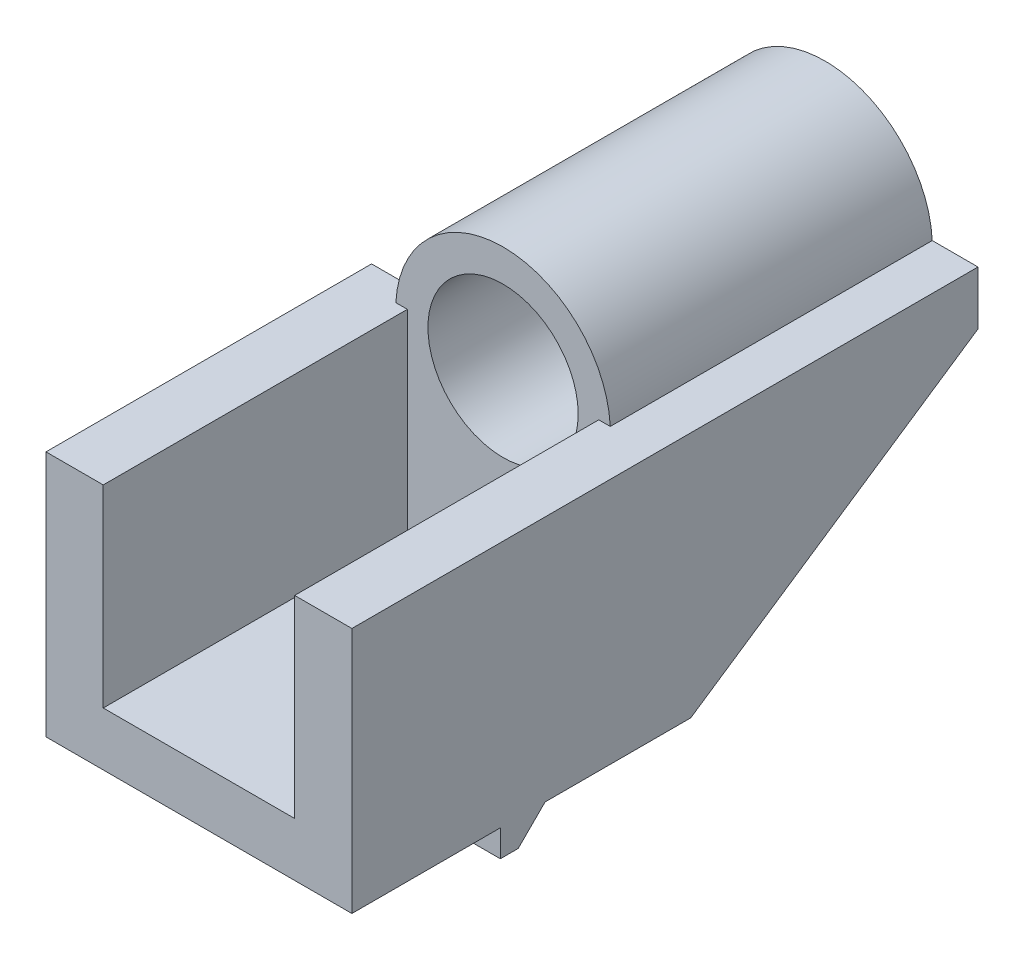
ISO-10303-21;
HEADER;
FILE_DESCRIPTION(('STEP AP214'),'2;1');
FILE_NAME('part.step','',(''),(''),'','','');
FILE_SCHEMA(('AUTOMOTIVE_DESIGN { 1 0 10303 214 1 1 1 1 }'));
ENDSEC;
DATA;
#1=APPLICATION_CONTEXT('core data for automotive mechanical design processes');
#2=APPLICATION_PROTOCOL_DEFINITION('international standard','automotive_design',2000,#1);
#3=PRODUCT_CONTEXT('',#1,'mechanical');
#4=PRODUCT('Part','Part','',(#3));
#5=PRODUCT_RELATED_PRODUCT_CATEGORY('part','',(#4));
#6=PRODUCT_DEFINITION_FORMATION('','',#4);
#7=PRODUCT_DEFINITION_CONTEXT('part definition',#1,'design');
#8=PRODUCT_DEFINITION('design','',#6,#7);
#9=PRODUCT_DEFINITION_SHAPE('','',#8);
#10=(LENGTH_UNIT() NAMED_UNIT(*) SI_UNIT(.MILLI.,.METRE.));
#11=(NAMED_UNIT(*) PLANE_ANGLE_UNIT() SI_UNIT($,.RADIAN.));
#12=(NAMED_UNIT(*) SI_UNIT($,.STERADIAN.) SOLID_ANGLE_UNIT());
#13=UNCERTAINTY_MEASURE_WITH_UNIT(LENGTH_MEASURE(1.E-05),#10,'distance_accuracy_value','');
#14=(GEOMETRIC_REPRESENTATION_CONTEXT(3) GLOBAL_UNCERTAINTY_ASSIGNED_CONTEXT((#13)) GLOBAL_UNIT_ASSIGNED_CONTEXT((#10,
#11,#12)) REPRESENTATION_CONTEXT('',''));
#15=CARTESIAN_POINT('',(0.,0.,0.));
#16=DIRECTION('',(0.,0.,1.));
#17=DIRECTION('',(1.,0.,0.));
#18=AXIS2_PLACEMENT_3D('',#15,#16,#17);
#19=CARTESIAN_POINT('',(8.55,0.,35.));
#20=DIRECTION('',(0.,-1.,0.));
#21=DIRECTION('',(0.,0.,-1.));
#22=AXIS2_PLACEMENT_3D('',#19,#20,#21);
#23=PLANE('',#22);
#24=DIRECTION('',(1.,0.,0.));
#25=VECTOR('',#24,1.);
#26=CARTESIAN_POINT('',(-5.99240744087883,0.,16.8));
#27=LINE('',#26,#25);
#28=CARTESIAN_POINT('',(-8.55,0.,16.8));
#29=VERTEX_POINT('',#28);
#30=CARTESIAN_POINT('',(-5.99240744087883,0.,16.8));
#31=VERTEX_POINT('',#30);
#32=EDGE_CURVE('E645',#29,#31,#27,.T.);
#33=ORIENTED_EDGE('',*,*,#32,.F.);
#34=DIRECTION('',(0.,0.,1.));
#35=VECTOR('',#34,1.);
#36=CARTESIAN_POINT('',(-8.55,0.,35.));
#37=LINE('',#36,#35);
#38=CARTESIAN_POINT('',(-8.55,0.,35.));
#39=VERTEX_POINT('',#38);
#40=EDGE_CURVE('E433',#29,#39,#37,.T.);
#41=ORIENTED_EDGE('',*,*,#40,.T.);
#42=DIRECTION('',(-1.,0.,0.));
#43=VECTOR('',#42,1.);
#44=CARTESIAN_POINT('',(8.55,0.,35.));
#45=LINE('',#44,#43);
#46=CARTESIAN_POINT('',(-5.35,0.,35.));
#47=VERTEX_POINT('',#46);
#48=EDGE_CURVE('E447',#47,#39,#45,.T.);
#49=ORIENTED_EDGE('',*,*,#48,.F.);
#50=DIRECTION('',(0.,0.,1.));
#51=VECTOR('',#50,1.);
#52=CARTESIAN_POINT('',(-5.35,0.,18.));
#53=LINE('',#52,#51);
#54=CARTESIAN_POINT('',(-5.35,0.,18.));
#55=VERTEX_POINT('',#54);
#56=EDGE_CURVE('E436',#55,#47,#53,.T.);
#57=ORIENTED_EDGE('',*,*,#56,.F.);
#58=DIRECTION('',(-1.,0.,0.));
#59=VECTOR('',#58,1.);
#60=CARTESIAN_POINT('',(8.55,0.,18.));
#61=LINE('',#60,#59);
#62=CARTESIAN_POINT('',(-5.99240744087883,0.,18.));
#63=VERTEX_POINT('',#62);
#64=EDGE_CURVE('E473',#55,#63,#61,.T.);
#65=ORIENTED_EDGE('',*,*,#64,.T.);
#66=DIRECTION('',(0.,0.,1.));
#67=VECTOR('',#66,1.);
#68=CARTESIAN_POINT('',(-5.99240744087883,0.,0.));
#69=LINE('',#68,#67);
#70=EDGE_CURVE('E464',#63,#31,#69,.F.);
#71=ORIENTED_EDGE('',*,*,#70,.T.);
#72=EDGE_LOOP('',(#33,#41,#49,#57,#65,#71));
#73=FACE_BOUND('',#72,.T.);
#74=ADVANCED_FACE('F33',(#73),#23,.F.);
#75=CARTESIAN_POINT('',(8.55,-13.8,16.0587));
#76=DIRECTION('',(0.,1.,0.));
#77=DIRECTION('',(0.,0.,1.));
#78=AXIS2_PLACEMENT_3D('',#75,#76,#77);
#79=PLANE('',#78);
#80=CARTESIAN_POINT('',(0.,-13.8,25.));
#81=DIRECTION('',(0.,1.,0.));
#82=DIRECTION('',(0.,0.,1.));
#83=AXIS2_PLACEMENT_3D('',#80,#81,#82);
#84=CIRCLE('',#83,2.2);
#85=CARTESIAN_POINT('',(0.,-13.8,27.2));
#86=VERTEX_POINT('',#85);
#87=EDGE_CURVE('E316',#86,#86,#84,.T.);
#88=ORIENTED_EDGE('',*,*,#87,.T.);
#89=EDGE_LOOP('',(#88));
#90=FACE_BOUND('',#89,.T.);
#91=DIRECTION('',(0.,0.,1.));
#92=VECTOR('',#91,1.);
#93=CARTESIAN_POINT('',(5.353,-13.8,0.));
#94=LINE('',#93,#92);
#95=CARTESIAN_POINT('',(5.353,-13.8,16.0587));
#96=VERTEX_POINT('',#95);
#97=CARTESIAN_POINT('',(5.353,-13.8,16.8));
#98=VERTEX_POINT('',#97);
#99=EDGE_CURVE('E262',#96,#98,#94,.T.);
#100=ORIENTED_EDGE('',*,*,#99,.F.);
#101=DIRECTION('',(1.,0.,0.));
#102=VECTOR('',#101,1.);
#103=CARTESIAN_POINT('',(-8.55105,-13.8,16.0587));
#104=LINE('',#103,#102);
#105=CARTESIAN_POINT('',(8.55,-13.8,16.0587));
#106=VERTEX_POINT('',#105);
#107=EDGE_CURVE('E47',#96,#106,#104,.T.);
#108=ORIENTED_EDGE('',*,*,#107,.T.);
#109=DIRECTION('',(0.,0.,-1.));
#110=VECTOR('',#109,1.);
#111=CARTESIAN_POINT('',(8.55,-13.8,16.0587));
#112=LINE('',#111,#110);
#113=CARTESIAN_POINT('',(8.55,-13.8,24.202));
#114=VERTEX_POINT('',#113);
#115=EDGE_CURVE('E416',#114,#106,#112,.T.);
#116=ORIENTED_EDGE('',*,*,#115,.F.);
#117=DIRECTION('',(1.,0.,0.));
#118=VECTOR('',#117,1.);
#119=CARTESIAN_POINT('',(-8.55,-13.8,24.202));
#120=LINE('',#119,#118);
#121=CARTESIAN_POINT('',(4.053,-13.8,24.202));
#122=VERTEX_POINT('',#121);
#123=EDGE_CURVE('E351',#122,#114,#120,.T.);
#124=ORIENTED_EDGE('',*,*,#123,.F.);
#125=DIRECTION('',(0.,0.,1.));
#126=VECTOR('',#125,1.);
#127=CARTESIAN_POINT('',(4.053,-13.8,-0.001000000000001));
#128=LINE('',#127,#126);
#129=CARTESIAN_POINT('',(4.053,-13.8,26.702));
#130=VERTEX_POINT('',#129);
#131=EDGE_CURVE('E310',#122,#130,#128,.T.);
#132=ORIENTED_EDGE('',*,*,#131,.T.);
#133=DIRECTION('',(1.,0.,0.));
#134=VECTOR('',#133,1.);
#135=CARTESIAN_POINT('',(-8.55,-13.8,26.702));
#136=LINE('',#135,#134);
#137=CARTESIAN_POINT('',(8.55,-13.8,26.702));
#138=VERTEX_POINT('',#137);
#139=EDGE_CURVE('E354',#130,#138,#136,.T.);
#140=ORIENTED_EDGE('',*,*,#139,.T.);
#141=CARTESIAN_POINT('',(8.55,-13.8,35.));
#142=VERTEX_POINT('',#141);
#143=EDGE_CURVE('E404',#142,#138,#112,.T.);
#144=ORIENTED_EDGE('',*,*,#143,.F.);
#145=DIRECTION('',(-1.,0.,0.));
#146=VECTOR('',#145,1.);
#147=CARTESIAN_POINT('',(8.55,-13.8,35.));
#148=LINE('',#147,#146);
#149=CARTESIAN_POINT('',(-8.55,-13.8,35.));
#150=VERTEX_POINT('',#149);
#151=EDGE_CURVE('E448',#142,#150,#148,.T.);
#152=ORIENTED_EDGE('',*,*,#151,.T.);
#153=DIRECTION('',(0.,0.,-1.));
#154=VECTOR('',#153,1.);
#155=CARTESIAN_POINT('',(-8.55,-13.8,16.0587));
#156=LINE('',#155,#154);
#157=CARTESIAN_POINT('',(-8.55,-13.8,26.702));
#158=VERTEX_POINT('',#157);
#159=EDGE_CURVE('E441',#150,#158,#156,.T.);
#160=ORIENTED_EDGE('',*,*,#159,.T.);
#161=CARTESIAN_POINT('',(-4.053,-13.8,26.702));
#162=VERTEX_POINT('',#161);
#163=EDGE_CURVE('E369',#158,#162,#136,.T.);
#164=ORIENTED_EDGE('',*,*,#163,.T.);
#165=DIRECTION('',(0.,0.,1.));
#166=VECTOR('',#165,1.);
#167=CARTESIAN_POINT('',(-4.053,-13.8,-0.001000000000001));
#168=LINE('',#167,#166);
#169=CARTESIAN_POINT('',(-4.053,-13.8,24.202));
#170=VERTEX_POINT('',#169);
#171=EDGE_CURVE('E299',#170,#162,#168,.T.);
#172=ORIENTED_EDGE('',*,*,#171,.F.);
#173=CARTESIAN_POINT('',(-8.55,-13.8,24.202));
#174=VERTEX_POINT('',#173);
#175=EDGE_CURVE('E347',#174,#170,#120,.T.);
#176=ORIENTED_EDGE('',*,*,#175,.F.);
#177=CARTESIAN_POINT('',(-8.55,-13.8,16.8));
#178=VERTEX_POINT('',#177);
#179=EDGE_CURVE('E423',#174,#178,#156,.T.);
#180=ORIENTED_EDGE('',*,*,#179,.T.);
#181=DIRECTION('',(-1.,0.,0.));
#182=VECTOR('',#181,1.);
#183=CARTESIAN_POINT('',(-8.55,-13.8,16.8));
#184=LINE('',#183,#182);
#185=CARTESIAN_POINT('',(-5.353,-13.8,16.8));
#186=VERTEX_POINT('',#185);
#187=EDGE_CURVE('E234',#186,#178,#184,.T.);
#188=ORIENTED_EDGE('',*,*,#187,.F.);
#189=DIRECTION('',(-0.707106781186547,0.,0.707106781186548));
#190=VECTOR('',#189,1.);
#191=CARTESIAN_POINT('',(-1.553,-13.8,13.));
#192=LINE('',#191,#190);
#193=CARTESIAN_POINT('',(-1.553,-13.8,13.));
#194=VERTEX_POINT('',#193);
#195=EDGE_CURVE('E245',#194,#186,#192,.T.);
#196=ORIENTED_EDGE('',*,*,#195,.F.);
#197=DIRECTION('',(0.,0.,1.));
#198=VECTOR('',#197,1.);
#199=CARTESIAN_POINT('',(-1.553,-13.8,0.));
#200=LINE('',#199,#198);
#201=CARTESIAN_POINT('',(-1.553,-13.8,15.002));
#202=VERTEX_POINT('',#201);
#203=EDGE_CURVE('E288',#194,#202,#200,.T.);
#204=ORIENTED_EDGE('',*,*,#203,.T.);
#205=DIRECTION('',(1.,0.,0.));
#206=VECTOR('',#205,1.);
#207=CARTESIAN_POINT('',(-8.55,-13.8,15.002));
#208=LINE('',#207,#206);
#209=CARTESIAN_POINT('',(1.553,-13.8,15.002));
#210=VERTEX_POINT('',#209);
#211=EDGE_CURVE('E319',#202,#210,#208,.T.);
#212=ORIENTED_EDGE('',*,*,#211,.T.);
#213=DIRECTION('',(0.,0.,1.));
#214=VECTOR('',#213,1.);
#215=CARTESIAN_POINT('',(1.553,-13.8,0.));
#216=LINE('',#215,#214);
#217=CARTESIAN_POINT('',(1.553,-13.8,13.));
#218=VERTEX_POINT('',#217);
#219=EDGE_CURVE('E276',#218,#210,#216,.T.);
#220=ORIENTED_EDGE('',*,*,#219,.F.);
#221=DIRECTION('',(-0.707106781186548,0.,-0.707106781186547));
#222=VECTOR('',#221,1.);
#223=CARTESIAN_POINT('',(5.353,-13.8,16.8));
#224=LINE('',#223,#222);
#225=EDGE_CURVE('E264',#98,#218,#224,.T.);
#226=ORIENTED_EDGE('',*,*,#225,.F.);
#227=EDGE_LOOP('',(#100,#108,#116,#124,#132,#140,#144,#152,#160,#164,#172,#176,#180,#188,#196,
#204,#212,#220,#226));
#228=FACE_BOUND('',#227,.T.);
#229=ADVANCED_FACE('F401',(#90,#228),#79,.F.);
#230=CARTESIAN_POINT('',(-8.55,0.,0.));
#231=DIRECTION('',(-1.,0.,0.));
#232=DIRECTION('',(0.,0.,1.));
#233=AXIS2_PLACEMENT_3D('',#230,#231,#232);
#234=PLANE('',#233);
#235=ORIENTED_EDGE('',*,*,#40,.F.);
#236=DIRECTION('',(0.,1.,0.));
#237=VECTOR('',#236,1.);
#238=CARTESIAN_POINT('',(-8.55,0.,16.8));
#239=LINE('',#238,#237);
#240=EDGE_CURVE('E643',#178,#29,#239,.T.);
#241=ORIENTED_EDGE('',*,*,#240,.F.);
#242=ORIENTED_EDGE('',*,*,#179,.F.);
#243=DIRECTION('',(0.,0.707106781186548,-0.707106781186547));
#244=VECTOR('',#243,1.);
#245=CARTESIAN_POINT('',(-8.55,-15.3,25.702));
#246=LINE('',#245,#244);
#247=CARTESIAN_POINT('',(-8.55,-15.3,25.702));
#248=VERTEX_POINT('',#247);
#249=EDGE_CURVE('E335',#248,#174,#246,.T.);
#250=ORIENTED_EDGE('',*,*,#249,.F.);
#251=DIRECTION('',(0.,0.,-1.));
#252=VECTOR('',#251,1.);
#253=CARTESIAN_POINT('',(-8.55,-15.3,26.702));
#254=LINE('',#253,#252);
#255=CARTESIAN_POINT('',(-8.55,-15.3,26.702));
#256=VERTEX_POINT('',#255);
#257=EDGE_CURVE('E332',#256,#248,#254,.T.);
#258=ORIENTED_EDGE('',*,*,#257,.F.);
#259=DIRECTION('',(0.,-1.,0.));
#260=VECTOR('',#259,1.);
#261=CARTESIAN_POINT('',(-8.55,-13.8,26.702));
#262=LINE('',#261,#260);
#263=EDGE_CURVE('E336',#158,#256,#262,.T.);
#264=ORIENTED_EDGE('',*,*,#263,.F.);
#265=ORIENTED_EDGE('',*,*,#159,.F.);
#266=DIRECTION('',(0.,-1.,0.));
#267=VECTOR('',#266,1.);
#268=CARTESIAN_POINT('',(-8.55,-13.8,35.));
#269=LINE('',#268,#267);
#270=EDGE_CURVE('E435',#39,#150,#269,.T.);
#271=ORIENTED_EDGE('',*,*,#270,.F.);
#272=EDGE_LOOP('',(#235,#241,#242,#250,#258,#264,#265,#271));
#273=FACE_BOUND('',#272,.T.);
#274=ADVANCED_FACE('F508',(#273),#234,.T.);
#275=CARTESIAN_POINT('',(0.,-0.301750000000001,16.8));
#276=DIRECTION('',(0.,0.,-1.));
#277=DIRECTION('',(0.,1.,0.));
#278=AXIS2_PLACEMENT_3D('',#275,#276,#277);
#279=PLANE('',#278);
#280=DIRECTION('',(0.659479829449439,-0.751722258915711,0.));
#281=VECTOR('',#280,1.);
#282=CARTESIAN_POINT('',(1.553,-6.09728198593538,16.8));
#283=LINE('',#282,#281);
#284=CARTESIAN_POINT('',(1.553,-6.09728198593538,16.8));
#285=VERTEX_POINT('',#284);
#286=CARTESIAN_POINT('',(5.353,-10.4287936657762,16.8));
#287=VERTEX_POINT('',#286);
#288=EDGE_CURVE('E655',#285,#287,#283,.T.);
#289=ORIENTED_EDGE('',*,*,#288,.F.);
#290=CARTESIAN_POINT('',(0.,-0.301750000000001,16.8));
#291=DIRECTION('',(0.,0.,1.));
#292=DIRECTION('',(0.,1.,0.));
#293=AXIS2_PLACEMENT_3D('',#290,#291,#292);
#294=CIRCLE('',#293,6.);
#295=CARTESIAN_POINT('',(5.35905280226833,-3.,16.8));
#296=VERTEX_POINT('',#295);
#297=EDGE_CURVE('E668',#285,#296,#294,.T.);
#298=ORIENTED_EDGE('',*,*,#297,.T.);
#299=DIRECTION('',(-0.000814775659621067,-0.999999668070257,0.));
#300=VECTOR('',#299,1.);
#301=CARTESIAN_POINT('',(5.35905280226833,-3.,16.8));
#302=LINE('',#301,#300);
#303=EDGE_CURVE('E255',#296,#287,#302,.T.);
#304=ORIENTED_EDGE('',*,*,#303,.T.);
#305=EDGE_LOOP('',(#289,#298,#304));
#306=FACE_BOUND('',#305,.T.);
#307=ADVANCED_FACE('F611',(#306),#279,.T.);
#308=CARTESIAN_POINT('',(8.55,-3.,0.));
#309=DIRECTION('',(0.,0.829796898853625,0.558065503908732));
#310=DIRECTION('',(0.,-0.558065503908732,0.829796898853625));
#311=AXIS2_PLACEMENT_3D('',#308,#309,#310);
#312=PLANE('',#311);
#313=DIRECTION('',(0.,0.558065503908732,-0.829796898853625));
#314=VECTOR('',#313,1.);
#315=CARTESIAN_POINT('',(8.55,-3.,0.));
#316=LINE('',#315,#314);
#317=CARTESIAN_POINT('',(8.55,-3.,0.));
#318=VERTEX_POINT('',#317);
#319=EDGE_CURVE('E415',#106,#318,#316,.T.);
#320=ORIENTED_EDGE('',*,*,#319,.F.);
#321=ORIENTED_EDGE('',*,*,#107,.F.);
#322=DIRECTION('',(0.,0.558065503908732,-0.829796898853625));
#323=VECTOR('',#322,1.);
#324=CARTESIAN_POINT('',(5.353,-13.8,16.0587));
#325=LINE('',#324,#323);
#326=CARTESIAN_POINT('',(5.353,-10.4287936657762,11.0459971148705));
#327=VERTEX_POINT('',#326);
#328=EDGE_CURVE('E225',#96,#327,#325,.T.);
#329=ORIENTED_EDGE('',*,*,#328,.T.);
#330=DIRECTION('',(0.000454698292982337,0.558065446218557,-0.829796813073143));
#331=VECTOR('',#330,1.);
#332=CARTESIAN_POINT('',(5.35905346199838,-2.99919029266284,-0.00120396733473974));
#333=LINE('',#332,#331);
#334=CARTESIAN_POINT('',(5.35905280226833,-3.,0.));
#335=VERTEX_POINT('',#334);
#336=EDGE_CURVE('E229',#327,#335,#333,.T.);
#337=ORIENTED_EDGE('',*,*,#336,.T.);
#338=DIRECTION('',(-1.,0.,0.));
#339=VECTOR('',#338,1.);
#340=CARTESIAN_POINT('',(8.55,-3.,0.));
#341=LINE('',#340,#339);
#342=EDGE_CURVE('E449',#318,#335,#341,.T.);
#343=ORIENTED_EDGE('',*,*,#342,.F.);
#344=EDGE_LOOP('',(#320,#321,#329,#337,#343));
#345=FACE_BOUND('',#344,.T.);
#346=ADVANCED_FACE('F227',(#345),#312,.F.);
#347=CARTESIAN_POINT('',(-8.55,-15.3,25.702));
#348=DIRECTION('',(0.,-0.707106781186547,-0.707106781186548));
#349=DIRECTION('',(0.,0.707106781186548,-0.707106781186547));
#350=AXIS2_PLACEMENT_3D('',#347,#348,#349);
#351=PLANE('',#350);
#352=DIRECTION('',(0.,0.707106781186548,-0.707106781186547));
#353=VECTOR('',#352,1.);
#354=CARTESIAN_POINT('',(4.053,-1.6985,12.1005));
#355=LINE('',#354,#353);
#356=CARTESIAN_POINT('',(4.053,-15.3,25.702));
#357=VERTEX_POINT('',#356);
#358=EDGE_CURVE('E297',#357,#122,#355,.T.);
#359=ORIENTED_EDGE('',*,*,#358,.T.);
#360=ORIENTED_EDGE('',*,*,#123,.T.);
#361=DIRECTION('',(0.,0.707106781186548,-0.707106781186547));
#362=VECTOR('',#361,1.);
#363=CARTESIAN_POINT('',(8.55,-15.3,25.702));
#364=LINE('',#363,#362);
#365=CARTESIAN_POINT('',(8.55,-15.3,25.702));
#366=VERTEX_POINT('',#365);
#367=EDGE_CURVE('E340',#366,#114,#364,.T.);
#368=ORIENTED_EDGE('',*,*,#367,.F.);
#369=DIRECTION('',(1.,0.,0.));
#370=VECTOR('',#369,1.);
#371=CARTESIAN_POINT('',(-8.55,-15.3,25.702));
#372=LINE('',#371,#370);
#373=EDGE_CURVE('E357',#357,#366,#372,.T.);
#374=ORIENTED_EDGE('',*,*,#373,.F.);
#375=EDGE_LOOP('',(#359,#360,#368,#374));
#376=FACE_BOUND('',#375,.T.);
#377=ADVANCED_FACE('F534',(#376),#351,.T.);
#378=CARTESIAN_POINT('',(-8.55,-15.3,26.702));
#379=DIRECTION('',(0.,-1.,0.));
#380=DIRECTION('',(0.,0.,-1.));
#381=AXIS2_PLACEMENT_3D('',#378,#379,#380);
#382=PLANE('',#381);
#383=DIRECTION('',(0.,0.,1.));
#384=VECTOR('',#383,1.);
#385=CARTESIAN_POINT('',(4.053,-15.3,-0.001000000000001));
#386=LINE('',#385,#384);
#387=CARTESIAN_POINT('',(4.053,-15.3,26.702));
#388=VERTEX_POINT('',#387);
#389=EDGE_CURVE('E309',#357,#388,#386,.T.);
#390=ORIENTED_EDGE('',*,*,#389,.F.);
#391=ORIENTED_EDGE('',*,*,#373,.T.);
#392=DIRECTION('',(0.,0.,-1.));
#393=VECTOR('',#392,1.);
#394=CARTESIAN_POINT('',(8.55,-15.3,26.702));
#395=LINE('',#394,#393);
#396=CARTESIAN_POINT('',(8.55,-15.3,26.702));
#397=VERTEX_POINT('',#396);
#398=EDGE_CURVE('E337',#397,#366,#395,.T.);
#399=ORIENTED_EDGE('',*,*,#398,.F.);
#400=DIRECTION('',(1.,0.,0.));
#401=VECTOR('',#400,1.);
#402=CARTESIAN_POINT('',(-8.55,-15.3,26.702));
#403=LINE('',#402,#401);
#404=EDGE_CURVE('E365',#388,#397,#403,.T.);
#405=ORIENTED_EDGE('',*,*,#404,.F.);
#406=EDGE_LOOP('',(#390,#391,#399,#405));
#407=FACE_BOUND('',#406,.T.);
#408=ADVANCED_FACE('F551',(#407),#382,.T.);
#409=CARTESIAN_POINT('',(-8.55,-13.8,26.702));
#410=DIRECTION('',(0.,0.,1.));
#411=DIRECTION('',(1.,0.,0.));
#412=AXIS2_PLACEMENT_3D('',#409,#410,#411);
#413=PLANE('',#412);
#414=DIRECTION('',(0.,1.,0.));
#415=VECTOR('',#414,1.);
#416=CARTESIAN_POINT('',(4.053,-13.8,26.702));
#417=LINE('',#416,#415);
#418=EDGE_CURVE('E306',#388,#130,#417,.T.);
#419=ORIENTED_EDGE('',*,*,#418,.F.);
#420=ORIENTED_EDGE('',*,*,#404,.T.);
#421=DIRECTION('',(0.,-1.,0.));
#422=VECTOR('',#421,1.);
#423=CARTESIAN_POINT('',(8.55,-13.8,26.702));
#424=LINE('',#423,#422);
#425=EDGE_CURVE('E323',#138,#397,#424,.T.);
#426=ORIENTED_EDGE('',*,*,#425,.F.);
#427=ORIENTED_EDGE('',*,*,#139,.F.);
#428=EDGE_LOOP('',(#419,#420,#426,#427));
#429=FACE_BOUND('',#428,.T.);
#430=ADVANCED_FACE('F409',(#429),#413,.T.);
#431=DIRECTION('',(-1.,0.,0.));
#432=VECTOR('',#431,1.);
#433=CARTESIAN_POINT('',(8.55,0.,0.));
#434=LINE('',#433,#432);
#435=CARTESIAN_POINT('',(8.55,0.,0.));
#436=VERTEX_POINT('',#435);
#437=CARTESIAN_POINT('',(5.99240744087883,0.,0.));
#438=VERTEX_POINT('',#437);
#439=EDGE_CURVE('E432',#436,#438,#434,.T.);
#440=ORIENTED_EDGE('',*,*,#439,.T.);
#441=DIRECTION('',(0.,0.,1.));
#442=VECTOR('',#441,1.);
#443=CARTESIAN_POINT('',(5.99240744087883,0.,0.));
#444=LINE('',#443,#442);
#445=CARTESIAN_POINT('',(5.99240744087883,0.,18.));
#446=VERTEX_POINT('',#445);
#447=EDGE_CURVE('E460',#438,#446,#444,.T.);
#448=ORIENTED_EDGE('',*,*,#447,.T.);
#449=CARTESIAN_POINT('',(5.35,0.,18.));
#450=VERTEX_POINT('',#449);
#451=EDGE_CURVE('E474',#446,#450,#61,.T.);
#452=ORIENTED_EDGE('',*,*,#451,.T.);
#453=DIRECTION('',(0.,0.,1.));
#454=VECTOR('',#453,1.);
#455=CARTESIAN_POINT('',(5.35,0.,18.));
#456=LINE('',#455,#454);
#457=CARTESIAN_POINT('',(5.35,0.,35.));
#458=VERTEX_POINT('',#457);
#459=EDGE_CURVE('E492',#450,#458,#456,.T.);
#460=ORIENTED_EDGE('',*,*,#459,.T.);
#461=CARTESIAN_POINT('',(8.55,0.,35.));
#462=VERTEX_POINT('',#461);
#463=EDGE_CURVE('E40',#462,#458,#45,.T.);
#464=ORIENTED_EDGE('',*,*,#463,.F.);
#465=DIRECTION('',(0.,0.,1.));
#466=VECTOR('',#465,1.);
#467=CARTESIAN_POINT('',(8.55,0.,35.));
#468=LINE('',#467,#466);
#469=EDGE_CURVE('E444',#436,#462,#468,.T.);
#470=ORIENTED_EDGE('',*,*,#469,.F.);
#471=EDGE_LOOP('',(#440,#448,#452,#460,#464,#470));
#472=FACE_BOUND('',#471,.T.);
#473=ADVANCED_FACE('F458',(#472),#23,.F.);
#474=CARTESIAN_POINT('',(8.55,-13.8,35.));
#475=DIRECTION('',(0.,0.,-1.));
#476=DIRECTION('',(-1.,0.,0.));
#477=AXIS2_PLACEMENT_3D('',#474,#475,#476);
#478=PLANE('',#477);
#479=DIRECTION('',(1.,0.,0.));
#480=VECTOR('',#479,1.);
#481=CARTESIAN_POINT('',(-5.35,-10.8,35.));
#482=LINE('',#481,#480);
#483=CARTESIAN_POINT('',(-5.35,-10.8,35.));
#484=VERTEX_POINT('',#483);
#485=CARTESIAN_POINT('',(5.35,-10.8,35.));
#486=VERTEX_POINT('',#485);
#487=EDGE_CURVE('E487',#484,#486,#482,.T.);
#488=ORIENTED_EDGE('',*,*,#487,.F.);
#489=DIRECTION('',(0.,-1.,0.));
#490=VECTOR('',#489,1.);
#491=CARTESIAN_POINT('',(-5.35,0.,35.));
#492=LINE('',#491,#490);
#493=EDGE_CURVE('E476',#47,#484,#492,.T.);
#494=ORIENTED_EDGE('',*,*,#493,.F.);
#495=ORIENTED_EDGE('',*,*,#48,.T.);
#496=ORIENTED_EDGE('',*,*,#270,.T.);
#497=ORIENTED_EDGE('',*,*,#151,.F.);
#498=DIRECTION('',(0.,-1.,0.));
#499=VECTOR('',#498,1.);
#500=CARTESIAN_POINT('',(8.55,-13.8,35.));
#501=LINE('',#500,#499);
#502=EDGE_CURVE('E413',#462,#142,#501,.T.);
#503=ORIENTED_EDGE('',*,*,#502,.F.);
#504=ORIENTED_EDGE('',*,*,#463,.T.);
#505=DIRECTION('',(0.,1.,0.));
#506=VECTOR('',#505,1.);
#507=CARTESIAN_POINT('',(5.35,0.,35.));
#508=LINE('',#507,#506);
#509=EDGE_CURVE('E480',#486,#458,#508,.T.);
#510=ORIENTED_EDGE('',*,*,#509,.F.);
#511=EDGE_LOOP('',(#488,#494,#495,#496,#497,#503,#504,#510));
#512=FACE_BOUND('',#511,.T.);
#513=ADVANCED_FACE('F502',(#512),#478,.F.);
#514=CARTESIAN_POINT('',(8.55,0.,0.));
#515=DIRECTION('',(0.,0.,1.));
#516=DIRECTION('',(0.,-1.,0.));
#517=AXIS2_PLACEMENT_3D('',#514,#515,#516);
#518=PLANE('',#517);
#519=CARTESIAN_POINT('',(0.,-0.301749999999999,0.));
#520=DIRECTION('',(0.,0.,1.));
#521=DIRECTION('',(1.,0.,0.));
#522=AXIS2_PLACEMENT_3D('',#519,#520,#521);
#523=CIRCLE('',#522,4.2);
#524=CARTESIAN_POINT('',(4.2,-0.301749999999999,0.));
#525=VERTEX_POINT('',#524);
#526=EDGE_CURVE('E372',#525,#525,#523,.T.);
#527=ORIENTED_EDGE('',*,*,#526,.T.);
#528=EDGE_LOOP('',(#527));
#529=FACE_BOUND('',#528,.T.);
#530=ORIENTED_EDGE('',*,*,#342,.T.);
#531=CARTESIAN_POINT('',(0.,-0.301749999999999,0.));
#532=DIRECTION('',(0.,0.,1.));
#533=DIRECTION('',(1.,0.,0.));
#534=AXIS2_PLACEMENT_3D('',#531,#532,#533);
#535=CIRCLE('',#534,6.);
#536=EDGE_CURVE('E463',#438,#335,#535,.T.);
#537=ORIENTED_EDGE('',*,*,#536,.F.);
#538=ORIENTED_EDGE('',*,*,#439,.F.);
#539=DIRECTION('',(0.,1.,0.));
#540=VECTOR('',#539,1.);
#541=CARTESIAN_POINT('',(8.55,0.,0.));
#542=LINE('',#541,#540);
#543=EDGE_CURVE('E418',#318,#436,#542,.T.);
#544=ORIENTED_EDGE('',*,*,#543,.F.);
#545=EDGE_LOOP('',(#530,#537,#538,#544));
#546=FACE_BOUND('',#545,.T.);
#547=ADVANCED_FACE('F462',(#529,#546),#518,.F.);
#548=CARTESIAN_POINT('',(8.55,0.,0.));
#549=DIRECTION('',(-1.,0.,0.));
#550=DIRECTION('',(0.,0.,1.));
#551=AXIS2_PLACEMENT_3D('',#548,#549,#550);
#552=PLANE('',#551);
#553=ORIENTED_EDGE('',*,*,#115,.T.);
#554=ORIENTED_EDGE('',*,*,#319,.T.);
#555=ORIENTED_EDGE('',*,*,#543,.T.);
#556=ORIENTED_EDGE('',*,*,#469,.T.);
#557=ORIENTED_EDGE('',*,*,#502,.T.);
#558=ORIENTED_EDGE('',*,*,#143,.T.);
#559=ORIENTED_EDGE('',*,*,#425,.T.);
#560=ORIENTED_EDGE('',*,*,#398,.T.);
#561=ORIENTED_EDGE('',*,*,#367,.T.);
#562=EDGE_LOOP('',(#553,#554,#555,#556,#557,#558,#559,#560,#561));
#563=FACE_BOUND('',#562,.T.);
#564=ADVANCED_FACE('F411',(#563),#552,.F.);
#565=CARTESIAN_POINT('',(-5.35,0.,18.));
#566=DIRECTION('',(-1.,0.,0.));
#567=DIRECTION('',(0.,-1.,0.));
#568=AXIS2_PLACEMENT_3D('',#565,#566,#567);
#569=PLANE('',#568);
#570=ORIENTED_EDGE('',*,*,#493,.T.);
#571=DIRECTION('',(0.,0.,1.));
#572=VECTOR('',#571,1.);
#573=CARTESIAN_POINT('',(-5.35,-10.8,18.));
#574=LINE('',#573,#572);
#575=CARTESIAN_POINT('',(-5.35,-10.8,18.));
#576=VERTEX_POINT('',#575);
#577=EDGE_CURVE('E485',#576,#484,#574,.T.);
#578=ORIENTED_EDGE('',*,*,#577,.F.);
#579=DIRECTION('',(0.,-1.,0.));
#580=VECTOR('',#579,1.);
#581=CARTESIAN_POINT('',(-5.35,0.,18.));
#582=LINE('',#581,#580);
#583=EDGE_CURVE('E477',#55,#576,#582,.T.);
#584=ORIENTED_EDGE('',*,*,#583,.F.);
#585=ORIENTED_EDGE('',*,*,#56,.T.);
#586=EDGE_LOOP('',(#570,#578,#584,#585));
#587=FACE_BOUND('',#586,.T.);
#588=ADVANCED_FACE('F688',(#587),#569,.F.);
#589=CARTESIAN_POINT('',(5.35,0.,18.));
#590=DIRECTION('',(1.,0.,0.));
#591=DIRECTION('',(0.,1.,0.));
#592=AXIS2_PLACEMENT_3D('',#589,#590,#591);
#593=PLANE('',#592);
#594=ORIENTED_EDGE('',*,*,#509,.T.);
#595=ORIENTED_EDGE('',*,*,#459,.F.);
#596=DIRECTION('',(0.,1.,0.));
#597=VECTOR('',#596,1.);
#598=CARTESIAN_POINT('',(5.35,0.,18.));
#599=LINE('',#598,#597);
#600=CARTESIAN_POINT('',(5.35,-10.8,18.));
#601=VERTEX_POINT('',#600);
#602=EDGE_CURVE('E483',#601,#450,#599,.T.);
#603=ORIENTED_EDGE('',*,*,#602,.F.);
#604=DIRECTION('',(0.,0.,1.));
#605=VECTOR('',#604,1.);
#606=CARTESIAN_POINT('',(5.35,-10.8,18.));
#607=LINE('',#606,#605);
#608=EDGE_CURVE('E495',#601,#486,#607,.T.);
#609=ORIENTED_EDGE('',*,*,#608,.T.);
#610=EDGE_LOOP('',(#594,#595,#603,#609));
#611=FACE_BOUND('',#610,.T.);
#612=ADVANCED_FACE('F679',(#611),#593,.F.);
#613=CARTESIAN_POINT('',(-5.35,-10.8,18.));
#614=DIRECTION('',(0.,-1.,0.));
#615=DIRECTION('',(1.,0.,0.));
#616=AXIS2_PLACEMENT_3D('',#613,#614,#615);
#617=PLANE('',#616);
#618=CARTESIAN_POINT('',(0.,-10.8,25.));
#619=DIRECTION('',(0.,1.,0.));
#620=DIRECTION('',(-1.,0.,0.));
#621=AXIS2_PLACEMENT_3D('',#618,#619,#620);
#622=CIRCLE('',#621,2.2);
#623=CARTESIAN_POINT('',(-2.2,-10.8,25.));
#624=VERTEX_POINT('',#623);
#625=EDGE_CURVE('E312',#624,#624,#622,.T.);
#626=ORIENTED_EDGE('',*,*,#625,.F.);
#627=EDGE_LOOP('',(#626));
#628=FACE_BOUND('',#627,.T.);
#629=ORIENTED_EDGE('',*,*,#487,.T.);
#630=ORIENTED_EDGE('',*,*,#608,.F.);
#631=DIRECTION('',(1.,0.,0.));
#632=VECTOR('',#631,1.);
#633=CARTESIAN_POINT('',(-5.35,-10.8,18.));
#634=LINE('',#633,#632);
#635=EDGE_CURVE('E479',#576,#601,#634,.T.);
#636=ORIENTED_EDGE('',*,*,#635,.F.);
#637=ORIENTED_EDGE('',*,*,#577,.T.);
#638=EDGE_LOOP('',(#629,#630,#636,#637));
#639=FACE_BOUND('',#638,.T.);
#640=ADVANCED_FACE('F682',(#628,#639),#617,.F.);
#641=CARTESIAN_POINT('',(0.,0.,18.));
#642=DIRECTION('',(0.,0.,1.));
#643=DIRECTION('',(1.,0.,0.));
#644=AXIS2_PLACEMENT_3D('',#641,#642,#643);
#645=PLANE('',#644);
#646=CARTESIAN_POINT('',(0.,-0.301749999999999,18.));
#647=DIRECTION('',(0.,0.,1.));
#648=DIRECTION('',(1.,0.,0.));
#649=AXIS2_PLACEMENT_3D('',#646,#647,#648);
#650=CIRCLE('',#649,4.2);
#651=CARTESIAN_POINT('',(4.2,-0.301749999999999,18.));
#652=VERTEX_POINT('',#651);
#653=EDGE_CURVE('E470',#652,#652,#650,.T.);
#654=ORIENTED_EDGE('',*,*,#653,.F.);
#655=EDGE_LOOP('',(#654));
#656=FACE_BOUND('',#655,.T.);
#657=ORIENTED_EDGE('',*,*,#602,.T.);
#658=ORIENTED_EDGE('',*,*,#451,.F.);
#659=CARTESIAN_POINT('',(0.,-0.301749999999999,18.));
#660=DIRECTION('',(0.,0.,1.));
#661=DIRECTION('',(1.,0.,0.));
#662=AXIS2_PLACEMENT_3D('',#659,#660,#661);
#663=CIRCLE('',#662,6.);
#664=EDGE_CURVE('E465',#446,#63,#663,.T.);
#665=ORIENTED_EDGE('',*,*,#664,.T.);
#666=ORIENTED_EDGE('',*,*,#64,.F.);
#667=ORIENTED_EDGE('',*,*,#583,.T.);
#668=ORIENTED_EDGE('',*,*,#635,.T.);
#669=EDGE_LOOP('',(#657,#658,#665,#666,#667,#668));
#670=FACE_BOUND('',#669,.T.);
#671=ADVANCED_FACE('F535',(#656,#670),#645,.T.);
#672=CARTESIAN_POINT('',(0.,-0.301749999999999,0.));
#673=DIRECTION('',(0.,0.,1.));
#674=DIRECTION('',(1.,0.,0.));
#675=AXIS2_PLACEMENT_3D('',#672,#673,#674);
#676=CYLINDRICAL_SURFACE('',#675,6.);
#677=ORIENTED_EDGE('',*,*,#447,.F.);
#678=ORIENTED_EDGE('',*,*,#536,.T.);
#679=DIRECTION('',(0.,0.,-1.));
#680=VECTOR('',#679,1.);
#681=CARTESIAN_POINT('',(5.35905280226833,-3.,16.8));
#682=LINE('',#681,#680);
#683=EDGE_CURVE('E244',#296,#335,#682,.T.);
#684=ORIENTED_EDGE('',*,*,#683,.F.);
#685=ORIENTED_EDGE('',*,*,#297,.F.);
#686=DIRECTION('',(0.,0.,1.));
#687=VECTOR('',#686,1.);
#688=CARTESIAN_POINT('',(1.553,-6.09728198593537,0.));
#689=LINE('',#688,#687);
#690=CARTESIAN_POINT('',(1.553,-6.09728198593538,8.5353865261744));
#691=VERTEX_POINT('',#690);
#692=EDGE_CURVE('E55',#285,#691,#689,.F.);
#693=ORIENTED_EDGE('',*,*,#692,.T.);
#694=CARTESIAN_POINT('',(0.,-0.301749999999999,5.17620731889345));
#695=DIRECTION('',(0.,0.50146903897387,0.865175590819935));
#696=DIRECTION('',(0.,-0.865175590819935,0.50146903897387));
#697=AXIS2_PLACEMENT_3D('',#694,#695,#696);
#698=ELLIPSE('',#697,6.93500841177656,6.);
#699=CARTESIAN_POINT('',(-1.553,-6.09728198593537,8.5353865261744));
#700=VERTEX_POINT('',#699);
#701=EDGE_CURVE('E667',#691,#700,#698,.F.);
#702=ORIENTED_EDGE('',*,*,#701,.T.);
#703=DIRECTION('',(0.,0.,1.));
#704=VECTOR('',#703,1.);
#705=CARTESIAN_POINT('',(-1.553,-6.09728198593537,0.));
#706=LINE('',#705,#704);
#707=CARTESIAN_POINT('',(-1.553,-6.09728198593537,16.8));
#708=VERTEX_POINT('',#707);
#709=EDGE_CURVE('E661',#708,#700,#706,.F.);
#710=ORIENTED_EDGE('',*,*,#709,.F.);
#711=EDGE_CURVE('E669',#31,#708,#294,.T.);
#712=ORIENTED_EDGE('',*,*,#711,.F.);
#713=ORIENTED_EDGE('',*,*,#70,.F.);
#714=ORIENTED_EDGE('',*,*,#664,.F.);
#715=EDGE_LOOP('',(#677,#678,#684,#685,#693,#702,#710,#712,#713,#714));
#716=FACE_BOUND('',#715,.T.);
#717=ADVANCED_FACE('F527',(#716),#676,.T.);
#718=CARTESIAN_POINT('',(0.,-0.301749999999999,0.));
#719=DIRECTION('',(0.,0.,1.));
#720=DIRECTION('',(1.,0.,0.));
#721=AXIS2_PLACEMENT_3D('',#718,#719,#720);
#722=CYLINDRICAL_SURFACE('',#721,4.2);
#723=ORIENTED_EDGE('',*,*,#526,.F.);
#724=EDGE_LOOP('',(#723));
#725=FACE_BOUND('',#724,.T.);
#726=ORIENTED_EDGE('',*,*,#653,.T.);
#727=EDGE_LOOP('',(#726));
#728=FACE_BOUND('',#727,.T.);
#729=ADVANCED_FACE('F525',(#725,#728),#722,.F.);
#730=DIRECTION('',(0.,-0.707106781186548,0.707106781186547));
#731=VECTOR('',#730,1.);
#732=CARTESIAN_POINT('',(-4.053,-1.6985,12.1005));
#733=LINE('',#732,#731);
#734=CARTESIAN_POINT('',(-4.053,-15.3,25.702));
#735=VERTEX_POINT('',#734);
#736=EDGE_CURVE('E298',#170,#735,#733,.T.);
#737=ORIENTED_EDGE('',*,*,#736,.T.);
#738=EDGE_CURVE('E353',#248,#735,#372,.T.);
#739=ORIENTED_EDGE('',*,*,#738,.F.);
#740=ORIENTED_EDGE('',*,*,#249,.T.);
#741=ORIENTED_EDGE('',*,*,#175,.T.);
#742=EDGE_LOOP('',(#737,#739,#740,#741));
#743=FACE_BOUND('',#742,.T.);
#744=ADVANCED_FACE('F516',(#743),#351,.T.);
#745=DIRECTION('',(0.,0.,1.));
#746=VECTOR('',#745,1.);
#747=CARTESIAN_POINT('',(-4.053,-15.3,-0.001000000000001));
#748=LINE('',#747,#746);
#749=CARTESIAN_POINT('',(-4.053,-15.3,26.702));
#750=VERTEX_POINT('',#749);
#751=EDGE_CURVE('E294',#735,#750,#748,.T.);
#752=ORIENTED_EDGE('',*,*,#751,.T.);
#753=EDGE_CURVE('E358',#256,#750,#403,.T.);
#754=ORIENTED_EDGE('',*,*,#753,.F.);
#755=ORIENTED_EDGE('',*,*,#257,.T.);
#756=ORIENTED_EDGE('',*,*,#738,.T.);
#757=EDGE_LOOP('',(#752,#754,#755,#756));
#758=FACE_BOUND('',#757,.T.);
#759=ADVANCED_FACE('F512',(#758),#382,.T.);
#760=DIRECTION('',(0.,-1.,0.));
#761=VECTOR('',#760,1.);
#762=CARTESIAN_POINT('',(-4.053,-13.8,26.702));
#763=LINE('',#762,#761);
#764=EDGE_CURVE('E293',#162,#750,#763,.T.);
#765=ORIENTED_EDGE('',*,*,#764,.F.);
#766=ORIENTED_EDGE('',*,*,#163,.F.);
#767=ORIENTED_EDGE('',*,*,#263,.T.);
#768=ORIENTED_EDGE('',*,*,#753,.T.);
#769=EDGE_LOOP('',(#765,#766,#767,#768));
#770=FACE_BOUND('',#769,.T.);
#771=ADVANCED_FACE('F552',(#770),#413,.T.);
#772=CARTESIAN_POINT('',(-8.55,-13.8,13.));
#773=DIRECTION('',(0.,-0.707812828367779,-0.706400028311158));
#774=DIRECTION('',(0.,0.706400028311158,-0.707812828367779));
#775=AXIS2_PLACEMENT_3D('',#772,#773,#774);
#776=PLANE('',#775);
#777=DIRECTION('',(0.,0.706400028311158,-0.707812828367779));
#778=VECTOR('',#777,1.);
#779=CARTESIAN_POINT('',(1.553,-13.8,13.));
#780=LINE('',#779,#778);
#781=CARTESIAN_POINT('',(1.553,-14.8,14.002));
#782=VERTEX_POINT('',#781);
#783=EDGE_CURVE('E280',#782,#218,#780,.T.);
#784=ORIENTED_EDGE('',*,*,#783,.F.);
#785=DIRECTION('',(1.,0.,0.));
#786=VECTOR('',#785,1.);
#787=CARTESIAN_POINT('',(-8.55,-14.8,14.002));
#788=LINE('',#787,#786);
#789=CARTESIAN_POINT('',(-1.553,-14.8,14.002));
#790=VERTEX_POINT('',#789);
#791=EDGE_CURVE('E324',#790,#782,#788,.T.);
#792=ORIENTED_EDGE('',*,*,#791,.F.);
#793=DIRECTION('',(0.,-0.706400028311158,0.707812828367779));
#794=VECTOR('',#793,1.);
#795=CARTESIAN_POINT('',(-1.553,-13.8,13.));
#796=LINE('',#795,#794);
#797=EDGE_CURVE('E290',#194,#790,#796,.T.);
#798=ORIENTED_EDGE('',*,*,#797,.F.);
#799=DIRECTION('',(1.,0.,0.));
#800=VECTOR('',#799,1.);
#801=CARTESIAN_POINT('',(-8.55,-13.8,13.));
#802=LINE('',#801,#800);
#803=EDGE_CURVE('E320',#194,#218,#802,.T.);
#804=ORIENTED_EDGE('',*,*,#803,.T.);
#805=EDGE_LOOP('',(#784,#792,#798,#804));
#806=FACE_BOUND('',#805,.T.);
#807=ADVANCED_FACE('F558',(#806),#776,.T.);
#808=CARTESIAN_POINT('',(-8.55,-14.8,14.002));
#809=DIRECTION('',(0.,-1.,0.));
#810=DIRECTION('',(0.,0.,-1.));
#811=AXIS2_PLACEMENT_3D('',#808,#809,#810);
#812=PLANE('',#811);
#813=DIRECTION('',(0.,0.,1.));
#814=VECTOR('',#813,1.);
#815=CARTESIAN_POINT('',(1.553,-14.8,0.));
#816=LINE('',#815,#814);
#817=CARTESIAN_POINT('',(1.553,-14.8,15.002));
#818=VERTEX_POINT('',#817);
#819=EDGE_CURVE('E277',#782,#818,#816,.T.);
#820=ORIENTED_EDGE('',*,*,#819,.T.);
#821=DIRECTION('',(1.,0.,0.));
#822=VECTOR('',#821,1.);
#823=CARTESIAN_POINT('',(-8.55,-14.8,15.002));
#824=LINE('',#823,#822);
#825=CARTESIAN_POINT('',(-1.553,-14.8,15.002));
#826=VERTEX_POINT('',#825);
#827=EDGE_CURVE('E327',#826,#818,#824,.T.);
#828=ORIENTED_EDGE('',*,*,#827,.F.);
#829=DIRECTION('',(0.,0.,1.));
#830=VECTOR('',#829,1.);
#831=CARTESIAN_POINT('',(-1.553,-14.8,0.));
#832=LINE('',#831,#830);
#833=EDGE_CURVE('E287',#790,#826,#832,.T.);
#834=ORIENTED_EDGE('',*,*,#833,.F.);
#835=ORIENTED_EDGE('',*,*,#791,.T.);
#836=EDGE_LOOP('',(#820,#828,#834,#835));
#837=FACE_BOUND('',#836,.T.);
#838=ADVANCED_FACE('F563',(#837),#812,.T.);
#839=CARTESIAN_POINT('',(-8.55,-14.8,15.002));
#840=DIRECTION('',(0.,0.,1.));
#841=DIRECTION('',(0.,-1.,0.));
#842=AXIS2_PLACEMENT_3D('',#839,#840,#841);
#843=PLANE('',#842);
#844=DIRECTION('',(0.,-1.,0.));
#845=VECTOR('',#844,1.);
#846=CARTESIAN_POINT('',(1.553,-14.8,15.002));
#847=LINE('',#846,#845);
#848=EDGE_CURVE('E270',#210,#818,#847,.T.);
#849=ORIENTED_EDGE('',*,*,#848,.F.);
#850=ORIENTED_EDGE('',*,*,#211,.F.);
#851=DIRECTION('',(0.,1.,0.));
#852=VECTOR('',#851,1.);
#853=CARTESIAN_POINT('',(-1.553,-14.8,15.002));
#854=LINE('',#853,#852);
#855=EDGE_CURVE('E284',#826,#202,#854,.T.);
#856=ORIENTED_EDGE('',*,*,#855,.F.);
#857=ORIENTED_EDGE('',*,*,#827,.T.);
#858=EDGE_LOOP('',(#849,#850,#856,#857));
#859=FACE_BOUND('',#858,.T.);
#860=ADVANCED_FACE('F569',(#859),#843,.T.);
#861=CARTESIAN_POINT('',(0.,-15.300025,25.));
#862=DIRECTION('',(0.,1.,0.));
#863=DIRECTION('',(-1.,0.,0.));
#864=AXIS2_PLACEMENT_3D('',#861,#862,#863);
#865=CYLINDRICAL_SURFACE('',#864,2.2);
#866=ORIENTED_EDGE('',*,*,#87,.F.);
#867=EDGE_LOOP('',(#866));
#868=FACE_BOUND('',#867,.T.);
#869=ORIENTED_EDGE('',*,*,#625,.T.);
#870=EDGE_LOOP('',(#869));
#871=FACE_BOUND('',#870,.T.);
#872=ADVANCED_FACE('F572',(#868,#871),#865,.F.);
#873=CARTESIAN_POINT('',(4.053,-13.8,-0.001000000000001));
#874=DIRECTION('',(1.,0.,0.));
#875=DIRECTION('',(0.,0.,-1.));
#876=AXIS2_PLACEMENT_3D('',#873,#874,#875);
#877=PLANE('',#876);
#878=ORIENTED_EDGE('',*,*,#389,.T.);
#879=ORIENTED_EDGE('',*,*,#418,.T.);
#880=ORIENTED_EDGE('',*,*,#131,.F.);
#881=ORIENTED_EDGE('',*,*,#358,.F.);
#882=EDGE_LOOP('',(#878,#879,#880,#881));
#883=FACE_BOUND('',#882,.T.);
#884=ADVANCED_FACE('F579',(#883),#877,.F.);
#885=CARTESIAN_POINT('',(-4.053,-13.8,-0.001000000000001));
#886=DIRECTION('',(-1.,0.,0.));
#887=DIRECTION('',(0.,0.,1.));
#888=AXIS2_PLACEMENT_3D('',#885,#886,#887);
#889=PLANE('',#888);
#890=ORIENTED_EDGE('',*,*,#171,.T.);
#891=ORIENTED_EDGE('',*,*,#764,.T.);
#892=ORIENTED_EDGE('',*,*,#751,.F.);
#893=ORIENTED_EDGE('',*,*,#736,.F.);
#894=EDGE_LOOP('',(#890,#891,#892,#893));
#895=FACE_BOUND('',#894,.T.);
#896=ADVANCED_FACE('F515',(#895),#889,.F.);
#897=CARTESIAN_POINT('',(-1.553,-14.8,0.));
#898=DIRECTION('',(1.,0.,0.));
#899=DIRECTION('',(0.,0.,-1.));
#900=AXIS2_PLACEMENT_3D('',#897,#898,#899);
#901=PLANE('',#900);
#902=ORIENTED_EDGE('',*,*,#797,.T.);
#903=ORIENTED_EDGE('',*,*,#833,.T.);
#904=ORIENTED_EDGE('',*,*,#855,.T.);
#905=ORIENTED_EDGE('',*,*,#203,.F.);
#906=EDGE_LOOP('',(#902,#903,#904,#905));
#907=FACE_BOUND('',#906,.T.);
#908=ADVANCED_FACE('F586',(#907),#901,.F.);
#909=CARTESIAN_POINT('',(1.553,-14.8,0.));
#910=DIRECTION('',(-1.,0.,0.));
#911=DIRECTION('',(0.,-1.,0.));
#912=AXIS2_PLACEMENT_3D('',#909,#910,#911);
#913=PLANE('',#912);
#914=ORIENTED_EDGE('',*,*,#783,.T.);
#915=ORIENTED_EDGE('',*,*,#219,.T.);
#916=ORIENTED_EDGE('',*,*,#848,.T.);
#917=ORIENTED_EDGE('',*,*,#819,.F.);
#918=EDGE_LOOP('',(#914,#915,#916,#917));
#919=FACE_BOUND('',#918,.T.);
#920=ADVANCED_FACE('F589',(#919),#913,.F.);
#921=CARTESIAN_POINT('',(5.353,5.69925,0.));
#922=DIRECTION('',(1.,0.,0.));
#923=DIRECTION('',(0.,0.,-1.));
#924=AXIS2_PLACEMENT_3D('',#921,#922,#923);
#925=PLANE('',#924);
#926=DIRECTION('',(0.,0.,-1.));
#927=VECTOR('',#926,1.);
#928=CARTESIAN_POINT('',(5.353,-10.4287936657762,16.8));
#929=LINE('',#928,#927);
#930=EDGE_CURVE('E241',#287,#327,#929,.T.);
#931=ORIENTED_EDGE('',*,*,#930,.T.);
#932=ORIENTED_EDGE('',*,*,#328,.F.);
#933=ORIENTED_EDGE('',*,*,#99,.T.);
#934=DIRECTION('',(0.,-1.,0.));
#935=VECTOR('',#934,1.);
#936=CARTESIAN_POINT('',(5.353,5.69925,16.8));
#937=LINE('',#936,#935);
#938=EDGE_CURVE('E251',#287,#98,#937,.T.);
#939=ORIENTED_EDGE('',*,*,#938,.F.);
#940=EDGE_LOOP('',(#931,#932,#933,#939));
#941=FACE_BOUND('',#940,.T.);
#942=ADVANCED_FACE('F249',(#941),#925,.F.);
#943=CARTESIAN_POINT('',(5.353,5.69925,16.8));
#944=DIRECTION('',(-0.707106781186547,0.,0.707106781186548));
#945=DIRECTION('',(0.707106781186548,0.,0.707106781186547));
#946=AXIS2_PLACEMENT_3D('',#943,#944,#945);
#947=PLANE('',#946);
#948=DIRECTION('',(0.,-1.,0.));
#949=VECTOR('',#948,1.);
#950=CARTESIAN_POINT('',(1.553,5.69925,13.));
#951=LINE('',#950,#949);
#952=CARTESIAN_POINT('',(1.553,-10.4287936657762,13.));
#953=VERTEX_POINT('',#952);
#954=EDGE_CURVE('E267',#953,#218,#951,.T.);
#955=ORIENTED_EDGE('',*,*,#954,.F.);
#956=DIRECTION('',(0.707106781186548,0.,0.707106781186547));
#957=VECTOR('',#956,1.);
#958=CARTESIAN_POINT('',(5.353,-10.4287936657762,16.8));
#959=LINE('',#958,#957);
#960=EDGE_CURVE('E246',#953,#287,#959,.T.);
#961=ORIENTED_EDGE('',*,*,#960,.T.);
#962=ORIENTED_EDGE('',*,*,#938,.T.);
#963=ORIENTED_EDGE('',*,*,#225,.T.);
#964=EDGE_LOOP('',(#955,#961,#962,#963));
#965=FACE_BOUND('',#964,.T.);
#966=ADVANCED_FACE('F597',(#965),#947,.F.);
#967=CARTESIAN_POINT('',(-1.553,5.69925,13.));
#968=DIRECTION('',(0.707106781186548,0.,0.707106781186547));
#969=DIRECTION('',(0.707106781186547,0.,-0.707106781186548));
#970=AXIS2_PLACEMENT_3D('',#967,#968,#969);
#971=PLANE('',#970);
#972=DIRECTION('',(0.,-1.,0.));
#973=VECTOR('',#972,1.);
#974=CARTESIAN_POINT('',(-5.353,5.69925,16.8));
#975=LINE('',#974,#973);
#976=CARTESIAN_POINT('',(-5.353,-10.4287936657762,16.8));
#977=VERTEX_POINT('',#976);
#978=EDGE_CURVE('E272',#977,#186,#975,.T.);
#979=ORIENTED_EDGE('',*,*,#978,.F.);
#980=DIRECTION('',(0.707106781186547,0.,-0.707106781186548));
#981=VECTOR('',#980,1.);
#982=CARTESIAN_POINT('',(-1.553,-10.4287936657762,13.));
#983=LINE('',#982,#981);
#984=CARTESIAN_POINT('',(-1.553,-10.4287936657762,13.));
#985=VERTEX_POINT('',#984);
#986=EDGE_CURVE('E11',#977,#985,#983,.T.);
#987=ORIENTED_EDGE('',*,*,#986,.T.);
#988=DIRECTION('',(0.,-1.,0.));
#989=VECTOR('',#988,1.);
#990=CARTESIAN_POINT('',(-1.553,5.69925,13.));
#991=LINE('',#990,#989);
#992=EDGE_CURVE('E266',#985,#194,#991,.T.);
#993=ORIENTED_EDGE('',*,*,#992,.T.);
#994=ORIENTED_EDGE('',*,*,#195,.T.);
#995=EDGE_LOOP('',(#979,#987,#993,#994));
#996=FACE_BOUND('',#995,.T.);
#997=ADVANCED_FACE('F594',(#996),#971,.F.);
#998=CARTESIAN_POINT('',(5.35905280226833,-3.,16.8));
#999=DIRECTION('',(0.999999668070257,-0.000814775659621067,0.));
#1000=DIRECTION('',(0.000814775659621067,0.999999668070257,0.));
#1001=AXIS2_PLACEMENT_3D('',#998,#999,#1000);
#1002=PLANE('',#1001);
#1003=ORIENTED_EDGE('',*,*,#930,.F.);
#1004=ORIENTED_EDGE('',*,*,#303,.F.);
#1005=ORIENTED_EDGE('',*,*,#683,.T.);
#1006=ORIENTED_EDGE('',*,*,#336,.F.);
#1007=EDGE_LOOP('',(#1003,#1004,#1005,#1006));
#1008=FACE_BOUND('',#1007,.T.);
#1009=ADVANCED_FACE('F239',(#1008),#1002,.F.);
#1010=DIRECTION('',(-0.659479829449439,-0.751722258915711,0.));
#1011=VECTOR('',#1010,1.);
#1012=CARTESIAN_POINT('',(-1.553,-6.09728198593538,16.8));
#1013=LINE('',#1012,#1011);
#1014=EDGE_CURVE('E635',#708,#977,#1013,.T.);
#1015=ORIENTED_EDGE('',*,*,#1014,.T.);
#1016=ORIENTED_EDGE('',*,*,#978,.T.);
#1017=ORIENTED_EDGE('',*,*,#187,.T.);
#1018=ORIENTED_EDGE('',*,*,#240,.T.);
#1019=ORIENTED_EDGE('',*,*,#32,.T.);
#1020=ORIENTED_EDGE('',*,*,#711,.T.);
#1021=EDGE_LOOP('',(#1015,#1016,#1017,#1018,#1019,#1020));
#1022=FACE_BOUND('',#1021,.T.);
#1023=ADVANCED_FACE('F606',(#1022),#279,.T.);
#1024=CARTESIAN_POINT('',(1.553,0.,0.));
#1025=DIRECTION('',(-1.,0.,0.));
#1026=DIRECTION('',(0.,0.,1.));
#1027=AXIS2_PLACEMENT_3D('',#1024,#1025,#1026);
#1028=PLANE('',#1027);
#1029=ORIENTED_EDGE('',*,*,#692,.F.);
#1030=DIRECTION('',(0.,0.751722258915712,0.659479829449438));
#1031=VECTOR('',#1030,1.);
#1032=CARTESIAN_POINT('',(1.553,-10.4287936657762,13.));
#1033=LINE('',#1032,#1031);
#1034=EDGE_CURVE('E652',#953,#285,#1033,.T.);
#1035=ORIENTED_EDGE('',*,*,#1034,.F.);
#1036=ORIENTED_EDGE('',*,*,#954,.T.);
#1037=DIRECTION('',(0.,0.865175590819935,-0.50146903897387));
#1038=VECTOR('',#1037,1.);
#1039=CARTESIAN_POINT('',(1.553,-13.8,13.));
#1040=LINE('',#1039,#1038);
#1041=EDGE_CURVE('E658',#218,#691,#1040,.T.);
#1042=ORIENTED_EDGE('',*,*,#1041,.T.);
#1043=EDGE_LOOP('',(#1029,#1035,#1036,#1042));
#1044=FACE_BOUND('',#1043,.T.);
#1045=ADVANCED_FACE('F609',(#1044),#1028,.F.);
#1046=CARTESIAN_POINT('',(-1.553,0.,0.));
#1047=DIRECTION('',(-1.,0.,0.));
#1048=DIRECTION('',(0.,0.,1.));
#1049=AXIS2_PLACEMENT_3D('',#1046,#1047,#1048);
#1050=PLANE('',#1049);
#1051=DIRECTION('',(0.,0.751722258915712,0.659479829449438));
#1052=VECTOR('',#1051,1.);
#1053=CARTESIAN_POINT('',(-1.553,-10.4287936657762,13.));
#1054=LINE('',#1053,#1052);
#1055=EDGE_CURVE('E637',#985,#708,#1054,.T.);
#1056=ORIENTED_EDGE('',*,*,#1055,.T.);
#1057=ORIENTED_EDGE('',*,*,#709,.T.);
#1058=DIRECTION('',(0.,0.865175590819935,-0.50146903897387));
#1059=VECTOR('',#1058,1.);
#1060=CARTESIAN_POINT('',(-1.553,-13.8,13.));
#1061=LINE('',#1060,#1059);
#1062=EDGE_CURVE('E657',#194,#700,#1061,.T.);
#1063=ORIENTED_EDGE('',*,*,#1062,.F.);
#1064=ORIENTED_EDGE('',*,*,#992,.F.);
#1065=EDGE_LOOP('',(#1056,#1057,#1063,#1064));
#1066=FACE_BOUND('',#1065,.T.);
#1067=ADVANCED_FACE('F616',(#1066),#1050,.T.);
#1068=CARTESIAN_POINT('',(1.553,-13.8,13.));
#1069=DIRECTION('',(0.,0.50146903897387,0.865175590819935));
#1070=DIRECTION('',(0.,-0.865175590819935,0.50146903897387));
#1071=AXIS2_PLACEMENT_3D('',#1068,#1069,#1070);
#1072=PLANE('',#1071);
#1073=ORIENTED_EDGE('',*,*,#701,.F.);
#1074=ORIENTED_EDGE('',*,*,#1041,.F.);
#1075=ORIENTED_EDGE('',*,*,#803,.F.);
#1076=ORIENTED_EDGE('',*,*,#1062,.T.);
#1077=EDGE_LOOP('',(#1073,#1074,#1075,#1076));
#1078=FACE_BOUND('',#1077,.T.);
#1079=ADVANCED_FACE('F612',(#1078),#1072,.F.);
#1080=CARTESIAN_POINT('',(-7.43637738557768,-6.523873454321,7.43637738557768));
#1081=DIRECTION('',(0.600880703783805,0.527147758831011,-0.600880703783805));
#1082=DIRECTION('',(-0.707106781186548,0.,-0.707106781186547));
#1083=AXIS2_PLACEMENT_3D('',#1080,#1081,#1082);
#1084=PLANE('',#1083);
#1085=ORIENTED_EDGE('',*,*,#960,.F.);
#1086=ORIENTED_EDGE('',*,*,#1034,.T.);
#1087=ORIENTED_EDGE('',*,*,#288,.T.);
#1088=EDGE_LOOP('',(#1085,#1086,#1087));
#1089=FACE_BOUND('',#1088,.T.);
#1090=ADVANCED_FACE('F615',(#1089),#1084,.T.);
#1091=CARTESIAN_POINT('',(7.43637738557768,-6.523873454321,7.43637738557768));
#1092=DIRECTION('',(-0.600880703783805,0.527147758831011,-0.600880703783805));
#1093=DIRECTION('',(0.707106781186548,0.,-0.707106781186547));
#1094=AXIS2_PLACEMENT_3D('',#1091,#1092,#1093);
#1095=PLANE('',#1094);
#1096=ORIENTED_EDGE('',*,*,#986,.F.);
#1097=ORIENTED_EDGE('',*,*,#1014,.F.);
#1098=ORIENTED_EDGE('',*,*,#1055,.F.);
#1099=EDGE_LOOP('',(#1096,#1097,#1098));
#1100=FACE_BOUND('',#1099,.T.);
#1101=ADVANCED_FACE('F626',(#1100),#1095,.T.);
#1102=CLOSED_SHELL('',(#74,#229,#274,#307,#346,#377,#408,#430,#473,#513,#547,#564,#588,#612,
#640,#671,#717,#729,#744,#759,#771,#807,#838,#860,#872,#884,#896,#908,#920,#942,#966,#997,#1009,
#1023,#1045,#1067,#1079,#1090,#1101));
#1103=MANIFOLD_SOLID_BREP('B2',#1102);
#1104=ADVANCED_BREP_SHAPE_REPRESENTATION('',(#18,#1103),#14);
#1105=SHAPE_DEFINITION_REPRESENTATION(#9,#1104);
ENDSEC;
END-ISO-10303-21;
